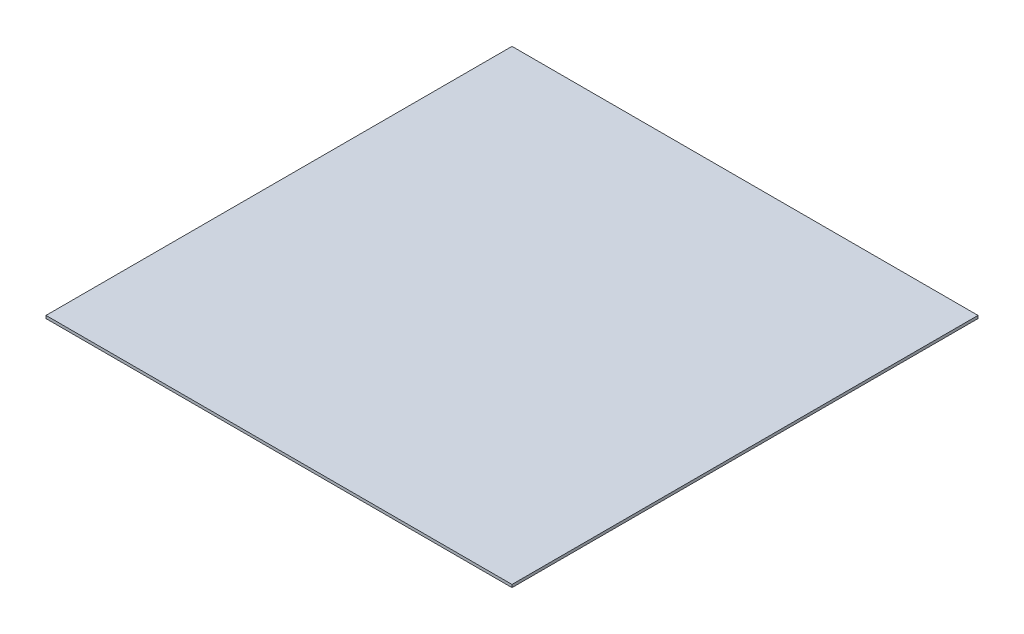
ISO-10303-21;
HEADER;
FILE_DESCRIPTION(('STEP AP214'),'2;1');
FILE_NAME('part.step','',(''),(''),'','','');
FILE_SCHEMA(('AUTOMOTIVE_DESIGN { 1 0 10303 214 1 1 1 1 }'));
ENDSEC;
DATA;
#1=APPLICATION_CONTEXT('core data for automotive mechanical design processes');
#2=APPLICATION_PROTOCOL_DEFINITION('international standard','automotive_design',2000,#1);
#3=PRODUCT_CONTEXT('',#1,'mechanical');
#4=PRODUCT('Part','Part','',(#3));
#5=PRODUCT_RELATED_PRODUCT_CATEGORY('part','',(#4));
#6=PRODUCT_DEFINITION_FORMATION('','',#4);
#7=PRODUCT_DEFINITION_CONTEXT('part definition',#1,'design');
#8=PRODUCT_DEFINITION('design','',#6,#7);
#9=PRODUCT_DEFINITION_SHAPE('','',#8);
#10=(LENGTH_UNIT() NAMED_UNIT(*) SI_UNIT(.MILLI.,.METRE.));
#11=(NAMED_UNIT(*) PLANE_ANGLE_UNIT() SI_UNIT($,.RADIAN.));
#12=(NAMED_UNIT(*) SI_UNIT($,.STERADIAN.) SOLID_ANGLE_UNIT());
#13=UNCERTAINTY_MEASURE_WITH_UNIT(LENGTH_MEASURE(1.E-05),#10,'distance_accuracy_value','');
#14=(GEOMETRIC_REPRESENTATION_CONTEXT(3) GLOBAL_UNCERTAINTY_ASSIGNED_CONTEXT((#13)) GLOBAL_UNIT_ASSIGNED_CONTEXT((#10,
#11,#12)) REPRESENTATION_CONTEXT('',''));
#15=CARTESIAN_POINT('',(0.,0.,0.));
#16=DIRECTION('',(0.,0.,1.));
#17=DIRECTION('',(1.,0.,0.));
#18=AXIS2_PLACEMENT_3D('',#15,#16,#17);
#19=CARTESIAN_POINT('',(250.,3.,250.));
#20=DIRECTION('',(-1.,0.,0.));
#21=DIRECTION('',(0.,0.,1.));
#22=AXIS2_PLACEMENT_3D('',#19,#20,#21);
#23=PLANE('',#22);
#24=DIRECTION('',(0.,0.,-1.));
#25=VECTOR('',#24,1.);
#26=CARTESIAN_POINT('',(250.,0.,250.));
#27=LINE('',#26,#25);
#28=CARTESIAN_POINT('',(250.,0.,250.));
#29=VERTEX_POINT('',#28);
#30=CARTESIAN_POINT('',(250.,0.,-250.));
#31=VERTEX_POINT('',#30);
#32=EDGE_CURVE('E107',#29,#31,#27,.T.);
#33=ORIENTED_EDGE('',*,*,#32,.T.);
#34=DIRECTION('',(0.,-1.,0.));
#35=VECTOR('',#34,1.);
#36=CARTESIAN_POINT('',(250.,3.,-250.));
#37=LINE('',#36,#35);
#38=CARTESIAN_POINT('',(250.,3.,-250.));
#39=VERTEX_POINT('',#38);
#40=EDGE_CURVE('E11',#39,#31,#37,.T.);
#41=ORIENTED_EDGE('',*,*,#40,.F.);
#42=DIRECTION('',(0.,0.,-1.));
#43=VECTOR('',#42,1.);
#44=CARTESIAN_POINT('',(250.,3.,250.));
#45=LINE('',#44,#43);
#46=CARTESIAN_POINT('',(250.,3.,250.));
#47=VERTEX_POINT('',#46);
#48=EDGE_CURVE('E91',#47,#39,#45,.T.);
#49=ORIENTED_EDGE('',*,*,#48,.F.);
#50=DIRECTION('',(0.,-1.,0.));
#51=VECTOR('',#50,1.);
#52=CARTESIAN_POINT('',(250.,3.,250.));
#53=LINE('',#52,#51);
#54=EDGE_CURVE('E103',#47,#29,#53,.T.);
#55=ORIENTED_EDGE('',*,*,#54,.T.);
#56=EDGE_LOOP('',(#33,#41,#49,#55));
#57=FACE_BOUND('',#56,.T.);
#58=ADVANCED_FACE('F39',(#57),#23,.F.);
#59=CARTESIAN_POINT('',(-250.,3.,-250.));
#60=DIRECTION('',(0.,0.,1.));
#61=DIRECTION('',(1.,0.,0.));
#62=AXIS2_PLACEMENT_3D('',#59,#60,#61);
#63=PLANE('',#62);
#64=DIRECTION('',(-1.,0.,0.));
#65=VECTOR('',#64,1.);
#66=CARTESIAN_POINT('',(-250.,0.,-250.));
#67=LINE('',#66,#65);
#68=CARTESIAN_POINT('',(-250.,0.,-250.));
#69=VERTEX_POINT('',#68);
#70=EDGE_CURVE('E96',#31,#69,#67,.T.);
#71=ORIENTED_EDGE('',*,*,#70,.T.);
#72=DIRECTION('',(0.,-1.,0.));
#73=VECTOR('',#72,1.);
#74=CARTESIAN_POINT('',(-250.,3.,-250.));
#75=LINE('',#74,#73);
#76=CARTESIAN_POINT('',(-250.,3.,-250.));
#77=VERTEX_POINT('',#76);
#78=EDGE_CURVE('E48',#77,#69,#75,.T.);
#79=ORIENTED_EDGE('',*,*,#78,.F.);
#80=DIRECTION('',(-1.,0.,0.));
#81=VECTOR('',#80,1.);
#82=CARTESIAN_POINT('',(-250.,3.,-250.));
#83=LINE('',#82,#81);
#84=EDGE_CURVE('E86',#39,#77,#83,.T.);
#85=ORIENTED_EDGE('',*,*,#84,.F.);
#86=ORIENTED_EDGE('',*,*,#40,.T.);
#87=EDGE_LOOP('',(#71,#79,#85,#86));
#88=FACE_BOUND('',#87,.T.);
#89=ADVANCED_FACE('F95',(#88),#63,.F.);
#90=CARTESIAN_POINT('',(-250.,3.,250.));
#91=DIRECTION('',(1.,0.,0.));
#92=DIRECTION('',(0.,0.,-1.));
#93=AXIS2_PLACEMENT_3D('',#90,#91,#92);
#94=PLANE('',#93);
#95=DIRECTION('',(0.,0.,1.));
#96=VECTOR('',#95,1.);
#97=CARTESIAN_POINT('',(-250.,0.,250.));
#98=LINE('',#97,#96);
#99=CARTESIAN_POINT('',(-250.,0.,250.));
#100=VERTEX_POINT('',#99);
#101=EDGE_CURVE('E73',#69,#100,#98,.T.);
#102=ORIENTED_EDGE('',*,*,#101,.T.);
#103=DIRECTION('',(0.,-1.,0.));
#104=VECTOR('',#103,1.);
#105=CARTESIAN_POINT('',(-250.,3.,250.));
#106=LINE('',#105,#104);
#107=CARTESIAN_POINT('',(-250.,3.,250.));
#108=VERTEX_POINT('',#107);
#109=EDGE_CURVE('E98',#108,#100,#106,.T.);
#110=ORIENTED_EDGE('',*,*,#109,.F.);
#111=DIRECTION('',(0.,0.,1.));
#112=VECTOR('',#111,1.);
#113=CARTESIAN_POINT('',(-250.,3.,250.));
#114=LINE('',#113,#112);
#115=EDGE_CURVE('E89',#77,#108,#114,.T.);
#116=ORIENTED_EDGE('',*,*,#115,.F.);
#117=ORIENTED_EDGE('',*,*,#78,.T.);
#118=EDGE_LOOP('',(#102,#110,#116,#117));
#119=FACE_BOUND('',#118,.T.);
#120=ADVANCED_FACE('F99',(#119),#94,.F.);
#121=CARTESIAN_POINT('',(-250.,3.,250.));
#122=DIRECTION('',(0.,0.,-1.));
#123=DIRECTION('',(-1.,0.,0.));
#124=AXIS2_PLACEMENT_3D('',#121,#122,#123);
#125=PLANE('',#124);
#126=DIRECTION('',(1.,0.,0.));
#127=VECTOR('',#126,1.);
#128=CARTESIAN_POINT('',(-250.,0.,250.));
#129=LINE('',#128,#127);
#130=EDGE_CURVE('E79',#100,#29,#129,.T.);
#131=ORIENTED_EDGE('',*,*,#130,.T.);
#132=ORIENTED_EDGE('',*,*,#54,.F.);
#133=DIRECTION('',(1.,0.,0.));
#134=VECTOR('',#133,1.);
#135=CARTESIAN_POINT('',(-250.,3.,250.));
#136=LINE('',#135,#134);
#137=EDGE_CURVE('E56',#108,#47,#136,.T.);
#138=ORIENTED_EDGE('',*,*,#137,.F.);
#139=ORIENTED_EDGE('',*,*,#109,.T.);
#140=EDGE_LOOP('',(#131,#132,#138,#139));
#141=FACE_BOUND('',#140,.T.);
#142=ADVANCED_FACE('F120',(#141),#125,.F.);
#143=CARTESIAN_POINT('',(0.,3.,0.));
#144=DIRECTION('',(0.,-1.,0.));
#145=DIRECTION('',(0.,0.,-1.));
#146=AXIS2_PLACEMENT_3D('',#143,#144,#145);
#147=PLANE('',#146);
#148=ORIENTED_EDGE('',*,*,#48,.T.);
#149=ORIENTED_EDGE('',*,*,#84,.T.);
#150=ORIENTED_EDGE('',*,*,#115,.T.);
#151=ORIENTED_EDGE('',*,*,#137,.T.);
#152=EDGE_LOOP('',(#148,#149,#150,#151));
#153=FACE_BOUND('',#152,.T.);
#154=ADVANCED_FACE('F87',(#153),#147,.F.);
#155=CARTESIAN_POINT('',(0.,0.,0.));
#156=DIRECTION('',(0.,-1.,0.));
#157=DIRECTION('',(0.,0.,-1.));
#158=AXIS2_PLACEMENT_3D('',#155,#156,#157);
#159=PLANE('',#158);
#160=ORIENTED_EDGE('',*,*,#32,.F.);
#161=ORIENTED_EDGE('',*,*,#130,.F.);
#162=ORIENTED_EDGE('',*,*,#101,.F.);
#163=ORIENTED_EDGE('',*,*,#70,.F.);
#164=EDGE_LOOP('',(#160,#161,#162,#163));
#165=FACE_BOUND('',#164,.T.);
#166=ADVANCED_FACE('F123',(#165),#159,.T.);
#167=CLOSED_SHELL('',(#58,#89,#120,#142,#154,#166));
#168=MANIFOLD_SOLID_BREP('B2',#167);
#169=ADVANCED_BREP_SHAPE_REPRESENTATION('',(#18,#168),#14);
#170=SHAPE_DEFINITION_REPRESENTATION(#9,#169);
ENDSEC;
END-ISO-10303-21;
